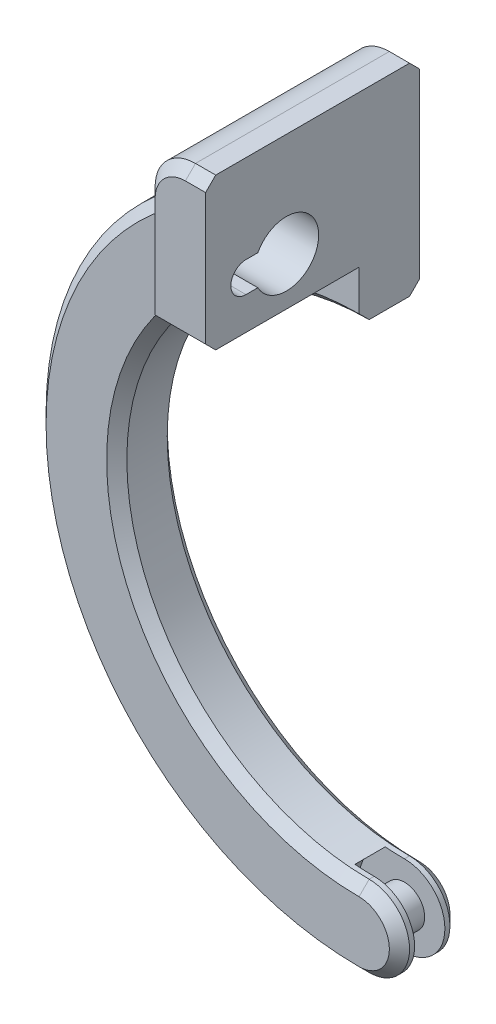
ISO-10303-21;
HEADER;
FILE_DESCRIPTION(('STEP AP214'),'2;1');
FILE_NAME('part.step','',(''),(''),'','','');
FILE_SCHEMA(('AUTOMOTIVE_DESIGN { 1 0 10303 214 1 1 1 1 }'));
ENDSEC;
DATA;
#1=APPLICATION_CONTEXT('core data for automotive mechanical design processes');
#2=APPLICATION_PROTOCOL_DEFINITION('international standard','automotive_design',2000,#1);
#3=PRODUCT_CONTEXT('',#1,'mechanical');
#4=PRODUCT('Part','Part','',(#3));
#5=PRODUCT_RELATED_PRODUCT_CATEGORY('part','',(#4));
#6=PRODUCT_DEFINITION_FORMATION('','',#4);
#7=PRODUCT_DEFINITION_CONTEXT('part definition',#1,'design');
#8=PRODUCT_DEFINITION('design','',#6,#7);
#9=PRODUCT_DEFINITION_SHAPE('','',#8);
#10=(LENGTH_UNIT() NAMED_UNIT(*) SI_UNIT(.MILLI.,.METRE.));
#11=(NAMED_UNIT(*) PLANE_ANGLE_UNIT() SI_UNIT($,.RADIAN.));
#12=(NAMED_UNIT(*) SI_UNIT($,.STERADIAN.) SOLID_ANGLE_UNIT());
#13=UNCERTAINTY_MEASURE_WITH_UNIT(LENGTH_MEASURE(1.E-05),#10,'distance_accuracy_value','');
#14=(GEOMETRIC_REPRESENTATION_CONTEXT(3) GLOBAL_UNCERTAINTY_ASSIGNED_CONTEXT((#13)) GLOBAL_UNIT_ASSIGNED_CONTEXT((#10,
#11,#12)) REPRESENTATION_CONTEXT('',''));
#15=CARTESIAN_POINT('',(0.,0.,0.));
#16=DIRECTION('',(0.,0.,1.));
#17=DIRECTION('',(1.,0.,0.));
#18=AXIS2_PLACEMENT_3D('',#15,#16,#17);
#19=CARTESIAN_POINT('',(0.,-32.,3.));
#20=DIRECTION('',(0.,0.,-1.));
#21=DIRECTION('',(-1.,0.,0.));
#22=AXIS2_PLACEMENT_3D('',#19,#20,#21);
#23=CYLINDRICAL_SURFACE('',#22,24.);
#24=DIRECTION('',(0.,0.,-1.));
#25=VECTOR('',#24,1.);
#26=CARTESIAN_POINT('',(0.,-8.00000000000001,3.));
#27=LINE('',#26,#25);
#28=CARTESIAN_POINT('',(0.,-8.00000000000001,2.));
#29=VERTEX_POINT('',#28);
#30=CARTESIAN_POINT('',(0.,-8.00000000000001,-1.99999999999999));
#31=VERTEX_POINT('',#30);
#32=EDGE_CURVE('E483',#29,#31,#27,.T.);
#33=ORIENTED_EDGE('',*,*,#32,.F.);
#34=CARTESIAN_POINT('',(0.,-32.,2.));
#35=DIRECTION('',(0.,0.,1.));
#36=DIRECTION('',(1.,0.,0.));
#37=AXIS2_PLACEMENT_3D('',#34,#35,#36);
#38=CIRCLE('',#37,24.);
#39=CARTESIAN_POINT('',(0.,-56.,2.));
#40=VERTEX_POINT('',#39);
#41=EDGE_CURVE('E243',#29,#40,#38,.T.);
#42=ORIENTED_EDGE('',*,*,#41,.T.);
#43=DIRECTION('',(0.,0.,-1.));
#44=VECTOR('',#43,1.);
#45=CARTESIAN_POINT('',(0.,-56.,3.));
#46=LINE('',#45,#44);
#47=CARTESIAN_POINT('',(0.,-56.,1.5));
#48=VERTEX_POINT('',#47);
#49=EDGE_CURVE('E476',#40,#48,#46,.T.);
#50=ORIENTED_EDGE('',*,*,#49,.T.);
#51=CARTESIAN_POINT('',(0.,-32.,1.5));
#52=DIRECTION('',(0.,0.,1.));
#53=DIRECTION('',(1.,0.,0.));
#54=AXIS2_PLACEMENT_3D('',#51,#52,#53);
#55=CIRCLE('',#54,24.);
#56=CARTESIAN_POINT('',(-1.90711756771621,-55.9241071428571,1.5));
#57=VERTEX_POINT('',#56);
#58=EDGE_CURVE('E550',#48,#57,#55,.F.);
#59=ORIENTED_EDGE('',*,*,#58,.T.);
#60=DIRECTION('',(0.,0.,1.));
#61=VECTOR('',#60,1.);
#62=CARTESIAN_POINT('',(-1.90711756771623,-55.9241071428571,0.));
#63=LINE('',#62,#61);
#64=CARTESIAN_POINT('',(-1.90711756771621,-55.9241071428571,-1.5));
#65=VERTEX_POINT('',#64);
#66=EDGE_CURVE('E484',#57,#65,#63,.F.);
#67=ORIENTED_EDGE('',*,*,#66,.T.);
#68=CARTESIAN_POINT('',(0.,-32.,-1.5));
#69=DIRECTION('',(0.,0.,1.));
#70=DIRECTION('',(1.,0.,0.));
#71=AXIS2_PLACEMENT_3D('',#68,#69,#70);
#72=CIRCLE('',#71,24.);
#73=CARTESIAN_POINT('',(0.,-56.,-1.5));
#74=VERTEX_POINT('',#73);
#75=EDGE_CURVE('E475',#74,#65,#72,.F.);
#76=ORIENTED_EDGE('',*,*,#75,.F.);
#77=CARTESIAN_POINT('',(0.,-56.,-1.99999999999999));
#78=VERTEX_POINT('',#77);
#79=EDGE_CURVE('E468',#74,#78,#46,.T.);
#80=ORIENTED_EDGE('',*,*,#79,.T.);
#81=CARTESIAN_POINT('',(0.,-32.,-1.99999999999999));
#82=DIRECTION('',(0.,0.,1.));
#83=DIRECTION('',(1.,0.,0.));
#84=AXIS2_PLACEMENT_3D('',#81,#82,#83);
#85=CIRCLE('',#84,24.);
#86=EDGE_CURVE('E240',#78,#31,#85,.F.);
#87=ORIENTED_EDGE('',*,*,#86,.T.);
#88=EDGE_LOOP('',(#33,#42,#50,#59,#67,#76,#80,#87));
#89=FACE_BOUND('',#88,.T.);
#90=ADVANCED_FACE('F36',(#89),#23,.F.);
#91=CARTESIAN_POINT('',(0.,-32.,3.));
#92=DIRECTION('',(0.,0.,-1.));
#93=DIRECTION('',(-1.,0.,0.));
#94=AXIS2_PLACEMENT_3D('',#91,#92,#93);
#95=CYLINDRICAL_SURFACE('',#94,32.);
#96=DIRECTION('',(0.,0.,-1.));
#97=VECTOR('',#96,1.);
#98=CARTESIAN_POINT('',(0.,-64.,3.));
#99=LINE('',#98,#97);
#100=CARTESIAN_POINT('',(0.,-64.,2.00000000000001));
#101=VERTEX_POINT('',#100);
#102=CARTESIAN_POINT('',(0.,-64.,1.5));
#103=VERTEX_POINT('',#102);
#104=EDGE_CURVE('E490',#101,#103,#99,.T.);
#105=ORIENTED_EDGE('',*,*,#104,.F.);
#106=CARTESIAN_POINT('',(0.,-32.,2.00000000000001));
#107=DIRECTION('',(0.,0.,1.));
#108=DIRECTION('',(1.,0.,0.));
#109=AXIS2_PLACEMENT_3D('',#106,#107,#108);
#110=CIRCLE('',#109,32.);
#111=CARTESIAN_POINT('',(-6.,-0.567532708996578,2.00000000000001));
#112=VERTEX_POINT('',#111);
#113=EDGE_CURVE('E260',#101,#112,#110,.F.);
#114=ORIENTED_EDGE('',*,*,#113,.T.);
#115=DIRECTION('',(0.,0.,-1.));
#116=VECTOR('',#115,1.);
#117=CARTESIAN_POINT('',(-6.,-0.567532708996578,16.9263375799849));
#118=LINE('',#117,#116);
#119=CARTESIAN_POINT('',(-6.,-0.567532708996578,-1.99999999999999));
#120=VERTEX_POINT('',#119);
#121=EDGE_CURVE('E450',#112,#120,#118,.T.);
#122=ORIENTED_EDGE('',*,*,#121,.T.);
#123=CARTESIAN_POINT('',(0.,-32.,-1.99999999999999));
#124=DIRECTION('',(0.,0.,1.));
#125=DIRECTION('',(1.,0.,0.));
#126=AXIS2_PLACEMENT_3D('',#123,#124,#125);
#127=CIRCLE('',#126,32.);
#128=CARTESIAN_POINT('',(0.,-64.,-1.99999999999999));
#129=VERTEX_POINT('',#128);
#130=EDGE_CURVE('E258',#120,#129,#127,.T.);
#131=ORIENTED_EDGE('',*,*,#130,.T.);
#132=CARTESIAN_POINT('',(0.,-64.,-1.5));
#133=VERTEX_POINT('',#132);
#134=EDGE_CURVE('E469',#133,#129,#99,.T.);
#135=ORIENTED_EDGE('',*,*,#134,.F.);
#136=CARTESIAN_POINT('',(0.,-32.,-1.5));
#137=DIRECTION('',(0.,0.,1.));
#138=DIRECTION('',(1.,0.,0.));
#139=AXIS2_PLACEMENT_3D('',#136,#137,#138);
#140=CIRCLE('',#139,32.);
#141=CARTESIAN_POINT('',(-2.20258555597225,-63.9241071428571,-1.5));
#142=VERTEX_POINT('',#141);
#143=EDGE_CURVE('E553',#142,#133,#140,.T.);
#144=ORIENTED_EDGE('',*,*,#143,.F.);
#145=DIRECTION('',(0.,0.,1.));
#146=VECTOR('',#145,1.);
#147=CARTESIAN_POINT('',(-2.20258555597223,-63.9241071428572,0.));
#148=LINE('',#147,#146);
#149=CARTESIAN_POINT('',(-2.20258555597225,-63.9241071428571,1.5));
#150=VERTEX_POINT('',#149);
#151=EDGE_CURVE('E498',#142,#150,#148,.T.);
#152=ORIENTED_EDGE('',*,*,#151,.T.);
#153=CARTESIAN_POINT('',(0.,-32.,1.5));
#154=DIRECTION('',(0.,0.,1.));
#155=DIRECTION('',(1.,0.,0.));
#156=AXIS2_PLACEMENT_3D('',#153,#154,#155);
#157=CIRCLE('',#156,32.);
#158=EDGE_CURVE('E545',#150,#103,#157,.T.);
#159=ORIENTED_EDGE('',*,*,#158,.T.);
#160=EDGE_LOOP('',(#105,#114,#122,#131,#135,#144,#152,#159));
#161=FACE_BOUND('',#160,.T.);
#162=ADVANCED_FACE('F339',(#161),#95,.T.);
#163=CARTESIAN_POINT('',(0.,-60.,3.));
#164=DIRECTION('',(0.,0.,-1.));
#165=DIRECTION('',(-1.,0.,0.));
#166=AXIS2_PLACEMENT_3D('',#163,#164,#165);
#167=CYLINDRICAL_SURFACE('',#166,4.);
#168=ORIENTED_EDGE('',*,*,#134,.T.);
#169=CARTESIAN_POINT('',(0.,-60.,-1.99999999999999));
#170=DIRECTION('',(0.,0.,1.));
#171=DIRECTION('',(1.,0.,0.));
#172=AXIS2_PLACEMENT_3D('',#169,#170,#171);
#173=CIRCLE('',#172,4.);
#174=EDGE_CURVE('E282',#129,#78,#173,.T.);
#175=ORIENTED_EDGE('',*,*,#174,.T.);
#176=ORIENTED_EDGE('',*,*,#79,.F.);
#177=CARTESIAN_POINT('',(0.,-60.,-1.5));
#178=DIRECTION('',(0.,0.,1.));
#179=DIRECTION('',(1.,0.,0.));
#180=AXIS2_PLACEMENT_3D('',#177,#178,#179);
#181=CIRCLE('',#180,4.);
#182=EDGE_CURVE('E496',#133,#74,#181,.T.);
#183=ORIENTED_EDGE('',*,*,#182,.F.);
#184=EDGE_LOOP('',(#168,#175,#176,#183));
#185=FACE_BOUND('',#184,.T.);
#186=ADVANCED_FACE('F338',(#185),#167,.T.);
#187=CARTESIAN_POINT('',(0.,-8.00000000000001,3.));
#188=DIRECTION('',(-1.,0.,0.));
#189=DIRECTION('',(0.,-1.,0.));
#190=AXIS2_PLACEMENT_3D('',#187,#188,#189);
#191=PLANE('',#190);
#192=DIRECTION('',(0.,0.,-1.));
#193=VECTOR('',#192,1.);
#194=CARTESIAN_POINT('',(0.,3.25,3.));
#195=LINE('',#194,#193);
#196=CARTESIAN_POINT('',(0.,3.25,14.2));
#197=VERTEX_POINT('',#196);
#198=CARTESIAN_POINT('',(0.,3.25,13.0266588050205));
#199=VERTEX_POINT('',#198);
#200=EDGE_CURVE('E514',#197,#199,#195,.T.);
#201=ORIENTED_EDGE('',*,*,#200,.T.);
#202=CARTESIAN_POINT('',(0.,1.75,10.2));
#203=DIRECTION('',(-1.,0.,0.));
#204=DIRECTION('',(0.,-1.,0.));
#205=AXIS2_PLACEMENT_3D('',#202,#203,#204);
#206=CIRCLE('',#205,3.2);
#207=CARTESIAN_POINT('',(0.,0.25,13.0266588050205));
#208=VERTEX_POINT('',#207);
#209=EDGE_CURVE('E223',#199,#208,#206,.T.);
#210=ORIENTED_EDGE('',*,*,#209,.T.);
#211=DIRECTION('',(0.,0.,-1.));
#212=VECTOR('',#211,1.);
#213=CARTESIAN_POINT('',(0.,0.249999999999997,3.));
#214=LINE('',#213,#212);
#215=CARTESIAN_POINT('',(0.,0.25,14.2));
#216=VERTEX_POINT('',#215);
#217=EDGE_CURVE('E520',#216,#208,#214,.T.);
#218=ORIENTED_EDGE('',*,*,#217,.F.);
#219=CARTESIAN_POINT('',(0.,1.75,14.2));
#220=DIRECTION('',(-1.,0.,0.));
#221=DIRECTION('',(0.,-1.,0.));
#222=AXIS2_PLACEMENT_3D('',#219,#220,#221);
#223=CIRCLE('',#222,1.5);
#224=EDGE_CURVE('E509',#216,#197,#223,.T.);
#225=ORIENTED_EDGE('',*,*,#224,.T.);
#226=EDGE_LOOP('',(#201,#210,#218,#225));
#227=FACE_BOUND('',#226,.T.);
#228=DIRECTION('',(0.,0.,-1.));
#229=VECTOR('',#228,1.);
#230=CARTESIAN_POINT('',(0.,12.,16.9263375799849));
#231=LINE('',#230,#229);
#232=CARTESIAN_POINT('',(0.,12.,17.2));
#233=VERTEX_POINT('',#232);
#234=CARTESIAN_POINT('',(0.,12.,-1.99999999999999));
#235=VERTEX_POINT('',#234);
#236=EDGE_CURVE('E457',#233,#235,#231,.T.);
#237=ORIENTED_EDGE('',*,*,#236,.F.);
#238=DIRECTION('',(0.,0.707106781186548,-0.707106781186548));
#239=VECTOR('',#238,1.);
#240=CARTESIAN_POINT('',(0.,11.,18.2));
#241=LINE('',#240,#239);
#242=CARTESIAN_POINT('',(0.,11.,18.2));
#243=VERTEX_POINT('',#242);
#244=EDGE_CURVE('E415',#233,#243,#241,.F.);
#245=ORIENTED_EDGE('',*,*,#244,.T.);
#246=DIRECTION('',(0.,1.,0.));
#247=VECTOR('',#246,1.);
#248=CARTESIAN_POINT('',(0.,0.,18.2));
#249=LINE('',#248,#247);
#250=CARTESIAN_POINT('',(0.,-2.00000000000001,18.2));
#251=VERTEX_POINT('',#250);
#252=EDGE_CURVE('E527',#251,#243,#249,.T.);
#253=ORIENTED_EDGE('',*,*,#252,.F.);
#254=DIRECTION('',(0.,0.707106781186548,0.707106781186548));
#255=VECTOR('',#254,1.);
#256=CARTESIAN_POINT('',(0.,-3.,17.2));
#257=LINE('',#256,#255);
#258=CARTESIAN_POINT('',(0.,-3.,17.2));
#259=VERTEX_POINT('',#258);
#260=EDGE_CURVE('E413',#251,#259,#257,.F.);
#261=ORIENTED_EDGE('',*,*,#260,.T.);
#262=DIRECTION('',(0.,0.,-1.));
#263=VECTOR('',#262,1.);
#264=CARTESIAN_POINT('',(0.,-3.,34.3554944214035));
#265=LINE('',#264,#263);
#266=CARTESIAN_POINT('',(0.,-3.,3.));
#267=VERTEX_POINT('',#266);
#268=EDGE_CURVE('E528',#259,#267,#265,.T.);
#269=ORIENTED_EDGE('',*,*,#268,.T.);
#270=DIRECTION('',(0.,1.,0.));
#271=VECTOR('',#270,1.);
#272=CARTESIAN_POINT('',(0.,-8.00000000000001,3.));
#273=LINE('',#272,#271);
#274=CARTESIAN_POINT('',(0.,-7.00000000000001,3.));
#275=VERTEX_POINT('',#274);
#276=EDGE_CURVE('E477',#275,#267,#273,.T.);
#277=ORIENTED_EDGE('',*,*,#276,.F.);
#278=DIRECTION('',(0.,-0.707106781186545,-0.70710678118655));
#279=VECTOR('',#278,1.);
#280=CARTESIAN_POINT('',(0.,-32.,-22.0000000000002));
#281=LINE('',#280,#279);
#282=EDGE_CURVE('E238',#275,#29,#281,.T.);
#283=ORIENTED_EDGE('',*,*,#282,.T.);
#284=ORIENTED_EDGE('',*,*,#32,.T.);
#285=DIRECTION('',(0.,0.707106781186552,-0.707106781186543));
#286=VECTOR('',#285,1.);
#287=CARTESIAN_POINT('',(0.,-32.,21.9999999999997));
#288=LINE('',#287,#286);
#289=CARTESIAN_POINT('',(0.,-6.99999999999998,-3.));
#290=VERTEX_POINT('',#289);
#291=EDGE_CURVE('E232',#31,#290,#288,.T.);
#292=ORIENTED_EDGE('',*,*,#291,.T.);
#293=DIRECTION('',(0.,1.,0.));
#294=VECTOR('',#293,1.);
#295=CARTESIAN_POINT('',(0.,-8.00000000000001,-3.));
#296=LINE('',#295,#294);
#297=CARTESIAN_POINT('',(0.,11.,-3.));
#298=VERTEX_POINT('',#297);
#299=EDGE_CURVE('E482',#290,#298,#296,.T.);
#300=ORIENTED_EDGE('',*,*,#299,.T.);
#301=DIRECTION('',(0.,0.707106781186544,0.707106781186552));
#302=VECTOR('',#301,1.);
#303=CARTESIAN_POINT('',(0.,11.,-3.));
#304=LINE('',#303,#302);
#305=EDGE_CURVE('E273',#298,#235,#304,.T.);
#306=ORIENTED_EDGE('',*,*,#305,.T.);
#307=EDGE_LOOP('',(#237,#245,#253,#261,#269,#277,#283,#284,#292,#300,#306));
#308=FACE_BOUND('',#307,.T.);
#309=ADVANCED_FACE('F336',(#227,#308),#191,.F.);
#310=ORIENTED_EDGE('',*,*,#49,.F.);
#311=CARTESIAN_POINT('',(0.,-60.,2.00000000000001));
#312=DIRECTION('',(0.,0.,1.));
#313=DIRECTION('',(1.,0.,0.));
#314=AXIS2_PLACEMENT_3D('',#311,#312,#313);
#315=CIRCLE('',#314,4.);
#316=EDGE_CURVE('E256',#40,#101,#315,.F.);
#317=ORIENTED_EDGE('',*,*,#316,.T.);
#318=ORIENTED_EDGE('',*,*,#104,.T.);
#319=CARTESIAN_POINT('',(0.,-60.,1.5));
#320=DIRECTION('',(0.,0.,1.));
#321=DIRECTION('',(1.,0.,0.));
#322=AXIS2_PLACEMENT_3D('',#319,#320,#321);
#323=CIRCLE('',#322,4.);
#324=EDGE_CURVE('E493',#103,#48,#323,.T.);
#325=ORIENTED_EDGE('',*,*,#324,.T.);
#326=EDGE_LOOP('',(#310,#317,#318,#325));
#327=FACE_BOUND('',#326,.T.);
#328=ADVANCED_FACE('F329',(#327),#167,.T.);
#329=CARTESIAN_POINT('',(0.,-32.,3.));
#330=DIRECTION('',(0.,0.,1.));
#331=DIRECTION('',(1.,0.,0.));
#332=AXIS2_PLACEMENT_3D('',#329,#330,#331);
#333=PLANE('',#332);
#334=CARTESIAN_POINT('',(0.,-32.,3.));
#335=DIRECTION('',(0.,0.,1.));
#336=DIRECTION('',(1.,0.,0.));
#337=AXIS2_PLACEMENT_3D('',#334,#335,#336);
#338=CIRCLE('',#337,31.);
#339=CARTESIAN_POINT('',(-6.,-1.5861873485089,3.));
#340=VERTEX_POINT('',#339);
#341=CARTESIAN_POINT('',(0.,-63.,3.));
#342=VERTEX_POINT('',#341);
#343=EDGE_CURVE('E249',#340,#342,#338,.T.);
#344=ORIENTED_EDGE('',*,*,#343,.T.);
#345=CARTESIAN_POINT('',(0.,-60.,3.));
#346=DIRECTION('',(0.,0.,1.));
#347=DIRECTION('',(1.,0.,0.));
#348=AXIS2_PLACEMENT_3D('',#345,#346,#347);
#349=CIRCLE('',#348,3.);
#350=CARTESIAN_POINT('',(0.,-57.,3.));
#351=VERTEX_POINT('',#350);
#352=EDGE_CURVE('E251',#342,#351,#349,.T.);
#353=ORIENTED_EDGE('',*,*,#352,.T.);
#354=CARTESIAN_POINT('',(0.,-32.,3.));
#355=DIRECTION('',(0.,0.,1.));
#356=DIRECTION('',(1.,0.,0.));
#357=AXIS2_PLACEMENT_3D('',#354,#355,#356);
#358=CIRCLE('',#357,25.);
#359=EDGE_CURVE('E230',#351,#275,#358,.F.);
#360=ORIENTED_EDGE('',*,*,#359,.T.);
#361=ORIENTED_EDGE('',*,*,#276,.T.);
#362=DIRECTION('',(-1.,0.,0.));
#363=VECTOR('',#362,1.);
#364=CARTESIAN_POINT('',(0.,-3.,3.));
#365=LINE('',#364,#363);
#366=CARTESIAN_POINT('',(-6.,-3.,3.));
#367=VERTEX_POINT('',#366);
#368=EDGE_CURVE('E524',#267,#367,#365,.T.);
#369=ORIENTED_EDGE('',*,*,#368,.T.);
#370=DIRECTION('',(0.,-1.,0.));
#371=VECTOR('',#370,1.);
#372=CARTESIAN_POINT('',(-6.,0.,3.));
#373=LINE('',#372,#371);
#374=EDGE_CURVE('E215',#340,#367,#373,.T.);
#375=ORIENTED_EDGE('',*,*,#374,.F.);
#376=EDGE_LOOP('',(#344,#353,#360,#361,#369,#375));
#377=FACE_BOUND('',#376,.T.);
#378=ADVANCED_FACE('F326',(#377),#333,.T.);
#379=CARTESIAN_POINT('',(0.,-32.,-3.));
#380=DIRECTION('',(0.,0.,1.));
#381=DIRECTION('',(1.,0.,0.));
#382=AXIS2_PLACEMENT_3D('',#379,#380,#381);
#383=PLANE('',#382);
#384=CARTESIAN_POINT('',(-2.,8.,-3.));
#385=DIRECTION('',(0.,0.,1.));
#386=DIRECTION('',(1.,0.,0.));
#387=AXIS2_PLACEMENT_3D('',#384,#385,#386);
#388=CIRCLE('',#387,3.);
#389=CARTESIAN_POINT('',(-5.,8.,-3.));
#390=VERTEX_POINT('',#389);
#391=CARTESIAN_POINT('',(-2.,11.,-3.));
#392=VERTEX_POINT('',#391);
#393=EDGE_CURVE('E268',#390,#392,#388,.F.);
#394=ORIENTED_EDGE('',*,*,#393,.T.);
#395=DIRECTION('',(1.,0.,0.));
#396=VECTOR('',#395,1.);
#397=CARTESIAN_POINT('',(0.,11.,-3.));
#398=LINE('',#397,#396);
#399=EDGE_CURVE('E270',#392,#298,#398,.T.);
#400=ORIENTED_EDGE('',*,*,#399,.T.);
#401=ORIENTED_EDGE('',*,*,#299,.F.);
#402=CARTESIAN_POINT('',(0.,-32.,-3.));
#403=DIRECTION('',(0.,0.,1.));
#404=DIRECTION('',(1.,0.,0.));
#405=AXIS2_PLACEMENT_3D('',#402,#403,#404);
#406=CIRCLE('',#405,25.);
#407=CARTESIAN_POINT('',(0.,-57.,-3.));
#408=VERTEX_POINT('',#407);
#409=EDGE_CURVE('E246',#290,#408,#406,.T.);
#410=ORIENTED_EDGE('',*,*,#409,.T.);
#411=CARTESIAN_POINT('',(0.,-60.,-3.));
#412=DIRECTION('',(0.,0.,1.));
#413=DIRECTION('',(1.,0.,0.));
#414=AXIS2_PLACEMENT_3D('',#411,#412,#413);
#415=CIRCLE('',#414,3.);
#416=CARTESIAN_POINT('',(0.,-63.,-3.));
#417=VERTEX_POINT('',#416);
#418=EDGE_CURVE('E266',#408,#417,#415,.F.);
#419=ORIENTED_EDGE('',*,*,#418,.T.);
#420=CARTESIAN_POINT('',(0.,-32.,-3.));
#421=DIRECTION('',(0.,0.,1.));
#422=DIRECTION('',(1.,0.,0.));
#423=AXIS2_PLACEMENT_3D('',#420,#421,#422);
#424=CIRCLE('',#423,31.);
#425=CARTESIAN_POINT('',(-5.,-1.40588291844329,-3.));
#426=VERTEX_POINT('',#425);
#427=EDGE_CURVE('E262',#417,#426,#424,.F.);
#428=ORIENTED_EDGE('',*,*,#427,.T.);
#429=DIRECTION('',(0.,1.,0.));
#430=VECTOR('',#429,1.);
#431=CARTESIAN_POINT('',(-5.,8.,-3.));
#432=LINE('',#431,#430);
#433=EDGE_CURVE('E264',#426,#390,#432,.T.);
#434=ORIENTED_EDGE('',*,*,#433,.T.);
#435=EDGE_LOOP('',(#394,#400,#401,#410,#419,#428,#434));
#436=FACE_BOUND('',#435,.T.);
#437=ADVANCED_FACE('F324',(#436),#383,.F.);
#438=CARTESIAN_POINT('',(0.,-60.,-1.5));
#439=DIRECTION('',(0.,0.,1.));
#440=DIRECTION('',(1.,0.,0.));
#441=AXIS2_PLACEMENT_3D('',#438,#439,#440);
#442=CYLINDRICAL_SURFACE('',#441,4.5);
#443=CARTESIAN_POINT('',(0.,-60.,1.5));
#444=DIRECTION('',(0.,0.,1.));
#445=DIRECTION('',(1.,0.,0.));
#446=AXIS2_PLACEMENT_3D('',#443,#444,#445);
#447=CIRCLE('',#446,4.5);
#448=EDGE_CURVE('E541',#57,#150,#447,.T.);
#449=ORIENTED_EDGE('',*,*,#448,.T.);
#450=ORIENTED_EDGE('',*,*,#151,.F.);
#451=CARTESIAN_POINT('',(0.,-60.,-1.5));
#452=DIRECTION('',(0.,0.,1.));
#453=DIRECTION('',(1.,0.,0.));
#454=AXIS2_PLACEMENT_3D('',#451,#452,#453);
#455=CIRCLE('',#454,4.5);
#456=EDGE_CURVE('E542',#65,#142,#455,.T.);
#457=ORIENTED_EDGE('',*,*,#456,.F.);
#458=ORIENTED_EDGE('',*,*,#66,.F.);
#459=EDGE_LOOP('',(#449,#450,#457,#458));
#460=FACE_BOUND('',#459,.T.);
#461=ADVANCED_FACE('F317',(#460),#442,.F.);
#462=CARTESIAN_POINT('',(0.,-60.,-1.5));
#463=DIRECTION('',(0.,0.,1.));
#464=DIRECTION('',(1.,0.,0.));
#465=AXIS2_PLACEMENT_3D('',#462,#463,#464);
#466=PLANE('',#465);
#467=CARTESIAN_POINT('',(0.,-60.,-1.5));
#468=DIRECTION('',(0.,0.,1.));
#469=DIRECTION('',(1.,0.,0.));
#470=AXIS2_PLACEMENT_3D('',#467,#468,#469);
#471=CIRCLE('',#470,2.);
#472=CARTESIAN_POINT('',(2.,-60.,-1.5));
#473=VERTEX_POINT('',#472);
#474=EDGE_CURVE('E456',#473,#473,#471,.F.);
#475=ORIENTED_EDGE('',*,*,#474,.T.);
#476=EDGE_LOOP('',(#475));
#477=FACE_BOUND('',#476,.T.);
#478=ORIENTED_EDGE('',*,*,#75,.T.);
#479=ORIENTED_EDGE('',*,*,#456,.T.);
#480=ORIENTED_EDGE('',*,*,#143,.T.);
#481=ORIENTED_EDGE('',*,*,#182,.T.);
#482=EDGE_LOOP('',(#478,#479,#480,#481));
#483=FACE_BOUND('',#482,.T.);
#484=ADVANCED_FACE('F314',(#477,#483),#466,.T.);
#485=CARTESIAN_POINT('',(0.,-60.,1.5));
#486=DIRECTION('',(0.,0.,1.));
#487=DIRECTION('',(1.,0.,0.));
#488=AXIS2_PLACEMENT_3D('',#485,#486,#487);
#489=PLANE('',#488);
#490=CARTESIAN_POINT('',(0.,-60.,1.5));
#491=DIRECTION('',(0.,0.,1.));
#492=DIRECTION('',(1.,0.,0.));
#493=AXIS2_PLACEMENT_3D('',#490,#491,#492);
#494=CIRCLE('',#493,2.);
#495=CARTESIAN_POINT('',(2.,-60.,1.5));
#496=VERTEX_POINT('',#495);
#497=EDGE_CURVE('E501',#496,#496,#494,.F.);
#498=ORIENTED_EDGE('',*,*,#497,.F.);
#499=EDGE_LOOP('',(#498));
#500=FACE_BOUND('',#499,.T.);
#501=ORIENTED_EDGE('',*,*,#324,.F.);
#502=ORIENTED_EDGE('',*,*,#158,.F.);
#503=ORIENTED_EDGE('',*,*,#448,.F.);
#504=ORIENTED_EDGE('',*,*,#58,.F.);
#505=EDGE_LOOP('',(#501,#502,#503,#504));
#506=FACE_BOUND('',#505,.T.);
#507=ADVANCED_FACE('F312',(#500,#506),#489,.F.);
#508=CARTESIAN_POINT('',(0.,-60.,7.15685424949238));
#509=DIRECTION('',(0.,0.,-1.));
#510=DIRECTION('',(-1.,0.,0.));
#511=AXIS2_PLACEMENT_3D('',#508,#509,#510);
#512=CYLINDRICAL_SURFACE('',#511,2.);
#513=ORIENTED_EDGE('',*,*,#497,.T.);
#514=EDGE_LOOP('',(#513));
#515=FACE_BOUND('',#514,.T.);
#516=ORIENTED_EDGE('',*,*,#474,.F.);
#517=EDGE_LOOP('',(#516));
#518=FACE_BOUND('',#517,.T.);
#519=ADVANCED_FACE('F308',(#515,#518),#512,.T.);
#520=CARTESIAN_POINT('',(-6.,8.,16.9263375799849));
#521=DIRECTION('',(-1.,0.,0.));
#522=DIRECTION('',(0.,-1.,0.));
#523=AXIS2_PLACEMENT_3D('',#520,#521,#522);
#524=PLANE('',#523);
#525=CARTESIAN_POINT('',(-6.,1.75,10.2));
#526=DIRECTION('',(-1.,0.,0.));
#527=DIRECTION('',(0.,-1.,0.));
#528=AXIS2_PLACEMENT_3D('',#525,#526,#527);
#529=CIRCLE('',#528,3.2);
#530=CARTESIAN_POINT('',(-6.,3.25,13.0266588050205));
#531=VERTEX_POINT('',#530);
#532=CARTESIAN_POINT('',(-6.,0.25,13.0266588050205));
#533=VERTEX_POINT('',#532);
#534=EDGE_CURVE('E220',#531,#533,#529,.T.);
#535=ORIENTED_EDGE('',*,*,#534,.F.);
#536=DIRECTION('',(0.,0.,-1.));
#537=VECTOR('',#536,1.);
#538=CARTESIAN_POINT('',(-6.,3.25,16.9263375799849));
#539=LINE('',#538,#537);
#540=CARTESIAN_POINT('',(-6.,3.25,14.2));
#541=VERTEX_POINT('',#540);
#542=EDGE_CURVE('E203',#541,#531,#539,.T.);
#543=ORIENTED_EDGE('',*,*,#542,.F.);
#544=CARTESIAN_POINT('',(-6.,1.75,14.2));
#545=DIRECTION('',(-1.,0.,0.));
#546=DIRECTION('',(0.,-1.,0.));
#547=AXIS2_PLACEMENT_3D('',#544,#545,#546);
#548=CIRCLE('',#547,1.5);
#549=CARTESIAN_POINT('',(-6.,0.25,14.2));
#550=VERTEX_POINT('',#549);
#551=EDGE_CURVE('E214',#550,#541,#548,.T.);
#552=ORIENTED_EDGE('',*,*,#551,.F.);
#553=DIRECTION('',(0.,0.,-1.));
#554=VECTOR('',#553,1.);
#555=CARTESIAN_POINT('',(-6.,0.250000000000001,16.9263375799849));
#556=LINE('',#555,#554);
#557=EDGE_CURVE('E229',#550,#533,#556,.T.);
#558=ORIENTED_EDGE('',*,*,#557,.T.);
#559=EDGE_LOOP('',(#535,#543,#552,#558));
#560=FACE_BOUND('',#559,.T.);
#561=DIRECTION('',(0.,0.,-1.));
#562=VECTOR('',#561,1.);
#563=CARTESIAN_POINT('',(-6.,-3.,34.3554944214035));
#564=LINE('',#563,#562);
#565=CARTESIAN_POINT('',(-6.,-3.,17.2));
#566=VERTEX_POINT('',#565);
#567=EDGE_CURVE('E523',#566,#367,#564,.T.);
#568=ORIENTED_EDGE('',*,*,#567,.F.);
#569=DIRECTION('',(0.,1.,0.));
#570=VECTOR('',#569,1.);
#571=CARTESIAN_POINT('',(-6.,8.,17.2));
#572=LINE('',#571,#570);
#573=CARTESIAN_POINT('',(-6.,8.,17.2));
#574=VERTEX_POINT('',#573);
#575=EDGE_CURVE('E11',#566,#574,#572,.T.);
#576=ORIENTED_EDGE('',*,*,#575,.T.);
#577=DIRECTION('',(0.,0.,-1.));
#578=VECTOR('',#577,1.);
#579=CARTESIAN_POINT('',(-6.,8.,16.9263375799849));
#580=LINE('',#579,#578);
#581=CARTESIAN_POINT('',(-6.,8.,-1.99999999999999));
#582=VERTEX_POINT('',#581);
#583=EDGE_CURVE('E452',#574,#582,#580,.T.);
#584=ORIENTED_EDGE('',*,*,#583,.T.);
#585=DIRECTION('',(0.,-1.,0.));
#586=VECTOR('',#585,1.);
#587=CARTESIAN_POINT('',(-6.,-0.567532708996578,-1.99999999999999));
#588=LINE('',#587,#586);
#589=EDGE_CURVE('E286',#582,#120,#588,.T.);
#590=ORIENTED_EDGE('',*,*,#589,.T.);
#591=ORIENTED_EDGE('',*,*,#121,.F.);
#592=CARTESIAN_POINT('',(-6.,-0.567532708996585,2.00000000000001));
#593=CARTESIAN_POINT('',(-6.,-0.737258679483396,2.16671739836421));
#594=CARTESIAN_POINT('',(-6.,-0.907009551322741,2.33340943085013));
#595=CARTESIAN_POINT('',(-6.,-1.24656109782681,2.6667427641835));
#596=CARTESIAN_POINT('',(-6.,-1.41636177249157,2.83338406503091));
#597=CARTESIAN_POINT('',(-6.,-1.5861873485089,3.));
#598=B_SPLINE_CURVE_WITH_KNOTS('',3,(#592,#593,#594,#595,#596,#597),.UNSPECIFIED.,.F.,.F.,(4,2,
4),(0.,0.71373267380759,1.42746534812098),.UNSPECIFIED.);
#599=EDGE_CURVE('E288',#112,#340,#598,.T.);
#600=ORIENTED_EDGE('',*,*,#599,.T.);
#601=ORIENTED_EDGE('',*,*,#374,.T.);
#602=EDGE_LOOP('',(#568,#576,#584,#590,#591,#600,#601));
#603=FACE_BOUND('',#602,.T.);
#604=ADVANCED_FACE('F228',(#560,#603),#524,.T.);
#605=CARTESIAN_POINT('',(-2.,8.,16.9263375799849));
#606=DIRECTION('',(0.,0.,-1.));
#607=DIRECTION('',(-1.,0.,0.));
#608=AXIS2_PLACEMENT_3D('',#605,#606,#607);
#609=CYLINDRICAL_SURFACE('',#608,4.);
#610=ORIENTED_EDGE('',*,*,#583,.F.);
#611=CARTESIAN_POINT('',(-2.,8.,17.2));
#612=DIRECTION('',(0.,0.,1.));
#613=DIRECTION('',(1.,0.,0.));
#614=AXIS2_PLACEMENT_3D('',#611,#612,#613);
#615=CIRCLE('',#614,4.);
#616=CARTESIAN_POINT('',(-2.,12.,17.2));
#617=VERTEX_POINT('',#616);
#618=EDGE_CURVE('E417',#574,#617,#615,.F.);
#619=ORIENTED_EDGE('',*,*,#618,.T.);
#620=DIRECTION('',(0.,0.,-1.));
#621=VECTOR('',#620,1.);
#622=CARTESIAN_POINT('',(-2.,12.,16.9263375799849));
#623=LINE('',#622,#621);
#624=CARTESIAN_POINT('',(-2.,12.,-1.99999999999999));
#625=VERTEX_POINT('',#624);
#626=EDGE_CURVE('E536',#617,#625,#623,.T.);
#627=ORIENTED_EDGE('',*,*,#626,.T.);
#628=CARTESIAN_POINT('',(-2.,8.,-1.99999999999999));
#629=DIRECTION('',(0.,0.,1.));
#630=DIRECTION('',(1.,0.,0.));
#631=AXIS2_PLACEMENT_3D('',#628,#629,#630);
#632=CIRCLE('',#631,4.);
#633=EDGE_CURVE('E279',#625,#582,#632,.T.);
#634=ORIENTED_EDGE('',*,*,#633,.T.);
#635=EDGE_LOOP('',(#610,#619,#627,#634));
#636=FACE_BOUND('',#635,.T.);
#637=ADVANCED_FACE('F307',(#636),#609,.T.);
#638=CARTESIAN_POINT('',(0.,12.,16.9263375799849));
#639=DIRECTION('',(0.,1.,0.));
#640=DIRECTION('',(0.,0.,1.));
#641=AXIS2_PLACEMENT_3D('',#638,#639,#640);
#642=PLANE('',#641);
#643=ORIENTED_EDGE('',*,*,#626,.F.);
#644=DIRECTION('',(1.,0.,0.));
#645=VECTOR('',#644,1.);
#646=CARTESIAN_POINT('',(0.,12.,17.2));
#647=LINE('',#646,#645);
#648=EDGE_CURVE('E411',#617,#233,#647,.T.);
#649=ORIENTED_EDGE('',*,*,#648,.T.);
#650=ORIENTED_EDGE('',*,*,#236,.T.);
#651=DIRECTION('',(-1.,0.,0.));
#652=VECTOR('',#651,1.);
#653=CARTESIAN_POINT('',(-2.,12.,-1.99999999999999));
#654=LINE('',#653,#652);
#655=EDGE_CURVE('E276',#235,#625,#654,.T.);
#656=ORIENTED_EDGE('',*,*,#655,.T.);
#657=EDGE_LOOP('',(#643,#649,#650,#656));
#658=FACE_BOUND('',#657,.T.);
#659=ADVANCED_FACE('F577',(#658),#642,.T.);
#660=CARTESIAN_POINT('',(0.,-3.,34.3554944214035));
#661=DIRECTION('',(0.,-1.,0.));
#662=DIRECTION('',(0.,0.,-1.));
#663=AXIS2_PLACEMENT_3D('',#660,#661,#662);
#664=PLANE('',#663);
#665=ORIENTED_EDGE('',*,*,#268,.F.);
#666=DIRECTION('',(-1.,0.,0.));
#667=VECTOR('',#666,1.);
#668=CARTESIAN_POINT('',(0.,-3.,17.2));
#669=LINE('',#668,#667);
#670=EDGE_CURVE('E46',#259,#566,#669,.T.);
#671=ORIENTED_EDGE('',*,*,#670,.T.);
#672=ORIENTED_EDGE('',*,*,#567,.T.);
#673=ORIENTED_EDGE('',*,*,#368,.F.);
#674=EDGE_LOOP('',(#665,#671,#672,#673));
#675=FACE_BOUND('',#674,.T.);
#676=ADVANCED_FACE('F566',(#675),#664,.T.);
#677=CARTESIAN_POINT('',(2.,8.,18.2));
#678=DIRECTION('',(0.,0.,1.));
#679=DIRECTION('',(1.,0.,0.));
#680=AXIS2_PLACEMENT_3D('',#677,#678,#679);
#681=PLANE('',#680);
#682=ORIENTED_EDGE('',*,*,#252,.T.);
#683=DIRECTION('',(-1.,0.,0.));
#684=VECTOR('',#683,1.);
#685=CARTESIAN_POINT('',(2.,11.,18.2));
#686=LINE('',#685,#684);
#687=CARTESIAN_POINT('',(-2.,11.,18.2));
#688=VERTEX_POINT('',#687);
#689=EDGE_CURVE('E408',#243,#688,#686,.T.);
#690=ORIENTED_EDGE('',*,*,#689,.T.);
#691=CARTESIAN_POINT('',(-2.,8.,18.2));
#692=DIRECTION('',(0.,0.,1.));
#693=DIRECTION('',(1.,0.,0.));
#694=AXIS2_PLACEMENT_3D('',#691,#692,#693);
#695=CIRCLE('',#694,3.00000000000001);
#696=CARTESIAN_POINT('',(-5.00000000000001,8.,18.2));
#697=VERTEX_POINT('',#696);
#698=EDGE_CURVE('E406',#688,#697,#695,.T.);
#699=ORIENTED_EDGE('',*,*,#698,.T.);
#700=DIRECTION('',(0.,-1.,0.));
#701=VECTOR('',#700,1.);
#702=CARTESIAN_POINT('',(-5.00000000000001,8.,18.2));
#703=LINE('',#702,#701);
#704=CARTESIAN_POINT('',(-5.00000000000001,-2.00000000000001,18.2));
#705=VERTEX_POINT('',#704);
#706=EDGE_CURVE('E296',#697,#705,#703,.T.);
#707=ORIENTED_EDGE('',*,*,#706,.T.);
#708=DIRECTION('',(1.,0.,0.));
#709=VECTOR('',#708,1.);
#710=CARTESIAN_POINT('',(2.,-2.00000000000001,18.2));
#711=LINE('',#710,#709);
#712=EDGE_CURVE('E404',#705,#251,#711,.T.);
#713=ORIENTED_EDGE('',*,*,#712,.T.);
#714=EDGE_LOOP('',(#682,#690,#699,#707,#713));
#715=FACE_BOUND('',#714,.T.);
#716=ADVANCED_FACE('F584',(#715),#681,.T.);
#717=CARTESIAN_POINT('',(-6.5,1.75,10.2));
#718=DIRECTION('',(1.,0.,0.));
#719=DIRECTION('',(0.,0.,-1.));
#720=AXIS2_PLACEMENT_3D('',#717,#718,#719);
#721=CYLINDRICAL_SURFACE('',#720,3.2);
#722=DIRECTION('',(1.,0.,0.));
#723=VECTOR('',#722,1.);
#724=CARTESIAN_POINT('',(-6.5,3.25,13.0266588050205));
#725=LINE('',#724,#723);
#726=EDGE_CURVE('E206',#531,#199,#725,.T.);
#727=ORIENTED_EDGE('',*,*,#726,.F.);
#728=ORIENTED_EDGE('',*,*,#534,.T.);
#729=DIRECTION('',(1.,0.,0.));
#730=VECTOR('',#729,1.);
#731=CARTESIAN_POINT('',(-6.5,0.25,13.0266588050205));
#732=LINE('',#731,#730);
#733=EDGE_CURVE('E512',#533,#208,#732,.T.);
#734=ORIENTED_EDGE('',*,*,#733,.T.);
#735=ORIENTED_EDGE('',*,*,#209,.F.);
#736=EDGE_LOOP('',(#727,#728,#734,#735));
#737=FACE_BOUND('',#736,.T.);
#738=ADVANCED_FACE('F218',(#737),#721,.F.);
#739=CARTESIAN_POINT('',(-6.5,0.249999999999995,0.));
#740=DIRECTION('',(0.,1.,0.));
#741=DIRECTION('',(0.,0.,1.));
#742=AXIS2_PLACEMENT_3D('',#739,#740,#741);
#743=PLANE('',#742);
#744=ORIENTED_EDGE('',*,*,#217,.T.);
#745=ORIENTED_EDGE('',*,*,#733,.F.);
#746=ORIENTED_EDGE('',*,*,#557,.F.);
#747=DIRECTION('',(1.,0.,0.));
#748=VECTOR('',#747,1.);
#749=CARTESIAN_POINT('',(-6.5,0.25,14.2));
#750=LINE('',#749,#748);
#751=EDGE_CURVE('E508',#550,#216,#750,.T.);
#752=ORIENTED_EDGE('',*,*,#751,.T.);
#753=EDGE_LOOP('',(#744,#745,#746,#752));
#754=FACE_BOUND('',#753,.T.);
#755=ADVANCED_FACE('F591',(#754),#743,.T.);
#756=CARTESIAN_POINT('',(-6.5,1.75,14.2));
#757=DIRECTION('',(1.,0.,0.));
#758=DIRECTION('',(0.,0.,-1.));
#759=AXIS2_PLACEMENT_3D('',#756,#757,#758);
#760=CYLINDRICAL_SURFACE('',#759,1.5);
#761=ORIENTED_EDGE('',*,*,#751,.F.);
#762=ORIENTED_EDGE('',*,*,#551,.T.);
#763=DIRECTION('',(1.,0.,0.));
#764=VECTOR('',#763,1.);
#765=CARTESIAN_POINT('',(-6.5,3.25,14.2));
#766=LINE('',#765,#764);
#767=EDGE_CURVE('E209',#541,#197,#766,.T.);
#768=ORIENTED_EDGE('',*,*,#767,.T.);
#769=ORIENTED_EDGE('',*,*,#224,.F.);
#770=EDGE_LOOP('',(#761,#762,#768,#769));
#771=FACE_BOUND('',#770,.T.);
#772=ADVANCED_FACE('F505',(#771),#760,.F.);
#773=CARTESIAN_POINT('',(-6.5,3.25000000000001,0.));
#774=DIRECTION('',(0.,1.,0.));
#775=DIRECTION('',(0.,0.,1.));
#776=AXIS2_PLACEMENT_3D('',#773,#774,#775);
#777=PLANE('',#776);
#778=ORIENTED_EDGE('',*,*,#767,.F.);
#779=ORIENTED_EDGE('',*,*,#542,.T.);
#780=ORIENTED_EDGE('',*,*,#726,.T.);
#781=ORIENTED_EDGE('',*,*,#200,.F.);
#782=EDGE_LOOP('',(#778,#779,#780,#781));
#783=FACE_BOUND('',#782,.T.);
#784=ADVANCED_FACE('F205',(#783),#777,.F.);
#785=CARTESIAN_POINT('',(0.,-32.,3.));
#786=DIRECTION('',(0.,0.,1.));
#787=DIRECTION('',(1.,0.,0.));
#788=AXIS2_PLACEMENT_3D('',#785,#786,#787);
#789=CONICAL_SURFACE('',#788,25.,0.785398163397445);
#790=ORIENTED_EDGE('',*,*,#359,.F.);
#791=DIRECTION('',(0.,-0.707106781186545,0.70710678118655));
#792=VECTOR('',#791,1.);
#793=CARTESIAN_POINT('',(0.,-46.,-8.00000000000008));
#794=LINE('',#793,#792);
#795=EDGE_CURVE('E254',#351,#40,#794,.F.);
#796=ORIENTED_EDGE('',*,*,#795,.T.);
#797=ORIENTED_EDGE('',*,*,#41,.F.);
#798=ORIENTED_EDGE('',*,*,#282,.F.);
#799=EDGE_LOOP('',(#790,#796,#797,#798));
#800=FACE_BOUND('',#799,.T.);
#801=ADVANCED_FACE('F350',(#800),#789,.F.);
#802=CARTESIAN_POINT('',(0.,-32.,-1.99999999999999));
#803=DIRECTION('',(0.,0.,-1.));
#804=DIRECTION('',(-1.,0.,0.));
#805=AXIS2_PLACEMENT_3D('',#802,#803,#804);
#806=CONICAL_SURFACE('',#805,24.,0.785398163397455);
#807=ORIENTED_EDGE('',*,*,#86,.F.);
#808=DIRECTION('',(0.,-0.707106781186552,-0.707106781186543));
#809=VECTOR('',#808,1.);
#810=CARTESIAN_POINT('',(0.,-46.,7.99999999999982));
#811=LINE('',#810,#809);
#812=EDGE_CURVE('E284',#78,#408,#811,.T.);
#813=ORIENTED_EDGE('',*,*,#812,.T.);
#814=ORIENTED_EDGE('',*,*,#409,.F.);
#815=ORIENTED_EDGE('',*,*,#291,.F.);
#816=EDGE_LOOP('',(#807,#813,#814,#815));
#817=FACE_BOUND('',#816,.T.);
#818=ADVANCED_FACE('F356',(#817),#806,.F.);
#819=CARTESIAN_POINT('',(0.,-32.,3.));
#820=DIRECTION('',(0.,0.,-1.));
#821=DIRECTION('',(-1.,0.,0.));
#822=AXIS2_PLACEMENT_3D('',#819,#820,#821);
#823=CONICAL_SURFACE('',#822,31.,0.785398163397448);
#824=ORIENTED_EDGE('',*,*,#599,.F.);
#825=ORIENTED_EDGE('',*,*,#113,.F.);
#826=DIRECTION('',(0.,-0.70710678118655,-0.707106781186545));
#827=VECTOR('',#826,1.);
#828=CARTESIAN_POINT('',(0.,-63.,3.));
#829=LINE('',#828,#827);
#830=EDGE_CURVE('E225',#342,#101,#829,.T.);
#831=ORIENTED_EDGE('',*,*,#830,.F.);
#832=ORIENTED_EDGE('',*,*,#343,.F.);
#833=EDGE_LOOP('',(#824,#825,#831,#832));
#834=FACE_BOUND('',#833,.T.);
#835=ADVANCED_FACE('F299',(#834),#823,.T.);
#836=CARTESIAN_POINT('',(0.,-60.,3.));
#837=DIRECTION('',(0.,0.,-1.));
#838=DIRECTION('',(-1.,0.,0.));
#839=AXIS2_PLACEMENT_3D('',#836,#837,#838);
#840=CONICAL_SURFACE('',#839,3.,0.785398163397448);
#841=ORIENTED_EDGE('',*,*,#830,.T.);
#842=ORIENTED_EDGE('',*,*,#316,.F.);
#843=ORIENTED_EDGE('',*,*,#795,.F.);
#844=ORIENTED_EDGE('',*,*,#352,.F.);
#845=EDGE_LOOP('',(#841,#842,#843,#844));
#846=FACE_BOUND('',#845,.T.);
#847=ADVANCED_FACE('F363',(#846),#840,.T.);
#848=CARTESIAN_POINT('',(0.,-60.,-1.99999999999999));
#849=DIRECTION('',(0.,0.,1.));
#850=DIRECTION('',(1.,0.,0.));
#851=AXIS2_PLACEMENT_3D('',#848,#849,#850);
#852=CONICAL_SURFACE('',#851,4.,0.785398163397441);
#853=ORIENTED_EDGE('',*,*,#812,.F.);
#854=ORIENTED_EDGE('',*,*,#174,.F.);
#855=DIRECTION('',(0.,-0.707106781186545,0.70710678118655));
#856=VECTOR('',#855,1.);
#857=CARTESIAN_POINT('',(0.,-63.,-3.));
#858=LINE('',#857,#856);
#859=EDGE_CURVE('E384',#417,#129,#858,.T.);
#860=ORIENTED_EDGE('',*,*,#859,.F.);
#861=ORIENTED_EDGE('',*,*,#418,.F.);
#862=EDGE_LOOP('',(#853,#854,#860,#861));
#863=FACE_BOUND('',#862,.T.);
#864=ADVANCED_FACE('F368',(#863),#852,.T.);
#865=CARTESIAN_POINT('',(0.,-32.,-1.99999999999999));
#866=DIRECTION('',(0.,0.,1.));
#867=DIRECTION('',(1.,0.,0.));
#868=AXIS2_PLACEMENT_3D('',#865,#866,#867);
#869=CONICAL_SURFACE('',#868,32.,0.785398163397441);
#870=ORIENTED_EDGE('',*,*,#859,.T.);
#871=ORIENTED_EDGE('',*,*,#130,.F.);
#872=CARTESIAN_POINT('',(-6.,-0.567532708996582,-1.99999999999999));
#873=CARTESIAN_POINT('',(-5.83274759957861,-0.705860320327048,-2.16725240042139));
#874=CARTESIAN_POINT('',(-5.66578807761823,-0.8448866336033,-2.33421192238177));
#875=CARTESIAN_POINT('',(-5.33245474412148,-1.12433670302901,-2.66754525587852));
#876=CARTESIAN_POINT('',(-5.16608093274852,-1.26476045956833,-2.83391906725148));
#877=CARTESIAN_POINT('',(-5.,-1.40588291844329,-3.));
#878=B_SPLINE_CURVE_WITH_KNOTS('',3,(#872,#873,#874,#875,#876,#877),.UNSPECIFIED.,.F.,.F.,(4,2,
4),(0.,0.822017954528338,1.64403613839004),.UNSPECIFIED.);
#879=EDGE_CURVE('E386',#426,#120,#878,.F.);
#880=ORIENTED_EDGE('',*,*,#879,.F.);
#881=ORIENTED_EDGE('',*,*,#427,.F.);
#882=EDGE_LOOP('',(#870,#871,#880,#881));
#883=FACE_BOUND('',#882,.T.);
#884=ADVANCED_FACE('F374',(#883),#869,.T.);
#885=CARTESIAN_POINT('',(-5.00000000000001,-32.,-3.));
#886=DIRECTION('',(-0.707106781186551,0.,-0.707106781186544));
#887=DIRECTION('',(0.,-1.,0.));
#888=AXIS2_PLACEMENT_3D('',#885,#886,#887);
#889=PLANE('',#888);
#890=ORIENTED_EDGE('',*,*,#879,.T.);
#891=ORIENTED_EDGE('',*,*,#589,.F.);
#892=DIRECTION('',(-0.707106781186544,0.,0.707106781186551));
#893=VECTOR('',#892,1.);
#894=CARTESIAN_POINT('',(-5.,8.,-3.));
#895=LINE('',#894,#893);
#896=EDGE_CURVE('E393',#390,#582,#895,.T.);
#897=ORIENTED_EDGE('',*,*,#896,.F.);
#898=ORIENTED_EDGE('',*,*,#433,.F.);
#899=EDGE_LOOP('',(#890,#891,#897,#898));
#900=FACE_BOUND('',#899,.T.);
#901=ADVANCED_FACE('F446',(#900),#889,.T.);
#902=CARTESIAN_POINT('',(-2.,8.,-3.));
#903=DIRECTION('',(0.,0.,1.));
#904=DIRECTION('',(1.,0.,0.));
#905=AXIS2_PLACEMENT_3D('',#902,#903,#904);
#906=CONICAL_SURFACE('',#905,3.,0.785398163397444);
#907=ORIENTED_EDGE('',*,*,#896,.T.);
#908=ORIENTED_EDGE('',*,*,#633,.F.);
#909=DIRECTION('',(0.,0.707106781186544,0.707106781186551));
#910=VECTOR('',#909,1.);
#911=CARTESIAN_POINT('',(-2.,11.,-3.));
#912=LINE('',#911,#910);
#913=EDGE_CURVE('E428',#392,#625,#912,.T.);
#914=ORIENTED_EDGE('',*,*,#913,.F.);
#915=ORIENTED_EDGE('',*,*,#393,.F.);
#916=EDGE_LOOP('',(#907,#908,#914,#915));
#917=FACE_BOUND('',#916,.T.);
#918=ADVANCED_FACE('F442',(#917),#906,.T.);
#919=CARTESIAN_POINT('',(0.,11.,-3.));
#920=DIRECTION('',(0.,0.707106781186552,-0.707106781186544));
#921=DIRECTION('',(-1.,0.,0.));
#922=AXIS2_PLACEMENT_3D('',#919,#920,#921);
#923=PLANE('',#922);
#924=ORIENTED_EDGE('',*,*,#913,.T.);
#925=ORIENTED_EDGE('',*,*,#655,.F.);
#926=ORIENTED_EDGE('',*,*,#305,.F.);
#927=ORIENTED_EDGE('',*,*,#399,.F.);
#928=EDGE_LOOP('',(#924,#925,#926,#927));
#929=FACE_BOUND('',#928,.T.);
#930=ADVANCED_FACE('F722',(#929),#923,.T.);
#931=CARTESIAN_POINT('',(0.,-3.,17.2));
#932=DIRECTION('',(0.,0.707106781186547,-0.707106781186547));
#933=DIRECTION('',(-1.,0.,0.));
#934=AXIS2_PLACEMENT_3D('',#931,#932,#933);
#935=PLANE('',#934);
#936=ORIENTED_EDGE('',*,*,#260,.F.);
#937=ORIENTED_EDGE('',*,*,#712,.F.);
#938=DIRECTION('',(0.577350269189626,0.577350269189626,0.577350269189626));
#939=VECTOR('',#938,1.);
#940=CARTESIAN_POINT('',(-1.66666666666667,1.33333333333333,21.5333333333333));
#941=LINE('',#940,#939);
#942=EDGE_CURVE('E41',#566,#705,#941,.T.);
#943=ORIENTED_EDGE('',*,*,#942,.F.);
#944=ORIENTED_EDGE('',*,*,#670,.F.);
#945=EDGE_LOOP('',(#936,#937,#943,#944));
#946=FACE_BOUND('',#945,.T.);
#947=ADVANCED_FACE('F39',(#946),#935,.F.);
#948=CARTESIAN_POINT('',(-5.00000000000001,8.,18.2));
#949=DIRECTION('',(0.707106781186547,0.,-0.707106781186547));
#950=DIRECTION('',(0.,-1.,0.));
#951=AXIS2_PLACEMENT_3D('',#948,#949,#950);
#952=PLANE('',#951);
#953=ORIENTED_EDGE('',*,*,#942,.T.);
#954=ORIENTED_EDGE('',*,*,#706,.F.);
#955=DIRECTION('',(0.707106781186547,0.,0.707106781186547));
#956=VECTOR('',#955,1.);
#957=CARTESIAN_POINT('',(-6.,8.,17.2));
#958=LINE('',#957,#956);
#959=EDGE_CURVE('E421',#574,#697,#958,.T.);
#960=ORIENTED_EDGE('',*,*,#959,.F.);
#961=ORIENTED_EDGE('',*,*,#575,.F.);
#962=EDGE_LOOP('',(#953,#954,#960,#961));
#963=FACE_BOUND('',#962,.T.);
#964=ADVANCED_FACE('F570',(#963),#952,.F.);
#965=CARTESIAN_POINT('',(-2.,8.,18.2));
#966=DIRECTION('',(0.,0.,-1.));
#967=DIRECTION('',(-1.,0.,0.));
#968=AXIS2_PLACEMENT_3D('',#965,#966,#967);
#969=CONICAL_SURFACE('',#968,3.00000000000001,0.785398163397448);
#970=ORIENTED_EDGE('',*,*,#959,.T.);
#971=ORIENTED_EDGE('',*,*,#698,.F.);
#972=DIRECTION('',(0.,-0.707106781186547,0.707106781186547));
#973=VECTOR('',#972,1.);
#974=CARTESIAN_POINT('',(-2.,12.,17.2));
#975=LINE('',#974,#973);
#976=EDGE_CURVE('E420',#617,#688,#975,.T.);
#977=ORIENTED_EDGE('',*,*,#976,.F.);
#978=ORIENTED_EDGE('',*,*,#618,.F.);
#979=EDGE_LOOP('',(#970,#971,#977,#978));
#980=FACE_BOUND('',#979,.T.);
#981=ADVANCED_FACE('F572',(#980),#969,.T.);
#982=CARTESIAN_POINT('',(2.,11.,18.2));
#983=DIRECTION('',(0.,-0.707106781186547,-0.707106781186547));
#984=DIRECTION('',(-1.,0.,0.));
#985=AXIS2_PLACEMENT_3D('',#982,#983,#984);
#986=PLANE('',#985);
#987=ORIENTED_EDGE('',*,*,#244,.F.);
#988=ORIENTED_EDGE('',*,*,#648,.F.);
#989=ORIENTED_EDGE('',*,*,#976,.T.);
#990=ORIENTED_EDGE('',*,*,#689,.F.);
#991=EDGE_LOOP('',(#987,#988,#989,#990));
#992=FACE_BOUND('',#991,.T.);
#993=ADVANCED_FACE('F580',(#992),#986,.F.);
#994=CLOSED_SHELL('',(#90,#162,#186,#309,#328,#378,#437,#461,#484,#507,#519,#604,#637,#659,#676,
#716,#738,#755,#772,#784,#801,#818,#835,#847,#864,#884,#901,#918,#930,#947,#964,#981,#993));
#995=MANIFOLD_SOLID_BREP('B2',#994);
#996=ADVANCED_BREP_SHAPE_REPRESENTATION('',(#18,#995),#14);
#997=SHAPE_DEFINITION_REPRESENTATION(#9,#996);
ENDSEC;
END-ISO-10303-21;
